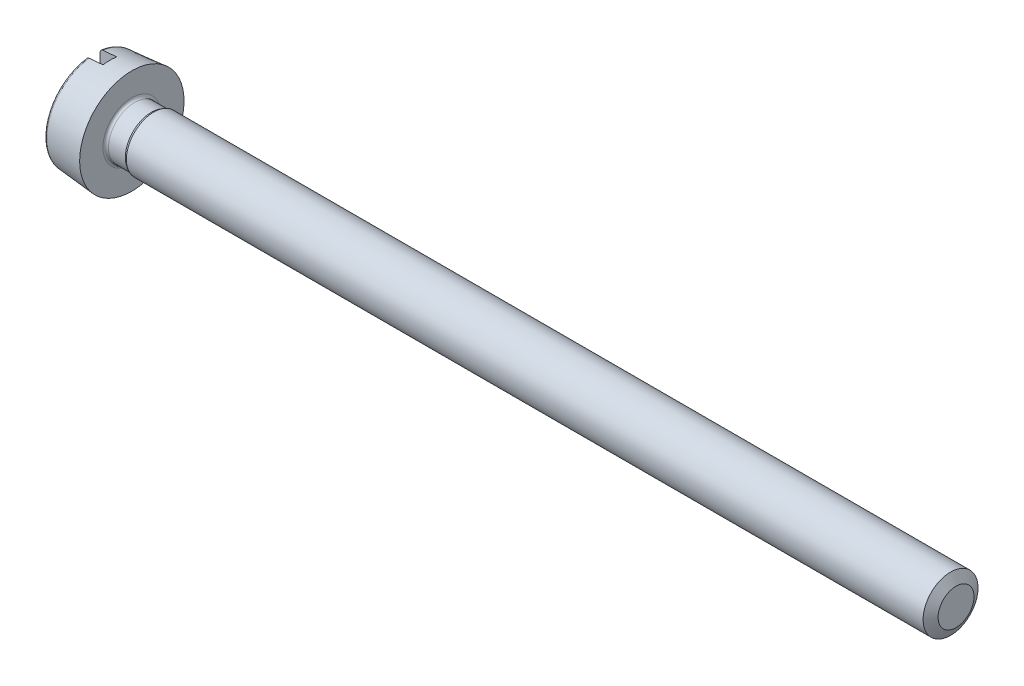
ISO-10303-21;
HEADER;
FILE_DESCRIPTION(('STEP AP214'),'2;1');
FILE_NAME('part.step','',(''),(''),'','','');
FILE_SCHEMA(('AUTOMOTIVE_DESIGN { 1 0 10303 214 1 1 1 1 }'));
ENDSEC;
DATA;
#1=APPLICATION_CONTEXT('core data for automotive mechanical design processes');
#2=APPLICATION_PROTOCOL_DEFINITION('international standard','automotive_design',2000,#1);
#3=PRODUCT_CONTEXT('',#1,'mechanical');
#4=PRODUCT('Part','Part','',(#3));
#5=PRODUCT_RELATED_PRODUCT_CATEGORY('part','',(#4));
#6=PRODUCT_DEFINITION_FORMATION('','',#4);
#7=PRODUCT_DEFINITION_CONTEXT('part definition',#1,'design');
#8=PRODUCT_DEFINITION('design','',#6,#7);
#9=PRODUCT_DEFINITION_SHAPE('','',#8);
#10=(LENGTH_UNIT() NAMED_UNIT(*) SI_UNIT(.MILLI.,.METRE.));
#11=(NAMED_UNIT(*) PLANE_ANGLE_UNIT() SI_UNIT($,.RADIAN.));
#12=(NAMED_UNIT(*) SI_UNIT($,.STERADIAN.) SOLID_ANGLE_UNIT());
#13=UNCERTAINTY_MEASURE_WITH_UNIT(LENGTH_MEASURE(1.E-05),#10,'distance_accuracy_value','');
#14=(GEOMETRIC_REPRESENTATION_CONTEXT(3) GLOBAL_UNCERTAINTY_ASSIGNED_CONTEXT((#13)) GLOBAL_UNIT_ASSIGNED_CONTEXT((#10,
#11,#12)) REPRESENTATION_CONTEXT('',''));
#15=CARTESIAN_POINT('',(0.,0.,0.));
#16=DIRECTION('',(0.,0.,1.));
#17=DIRECTION('',(1.,0.,0.));
#18=AXIS2_PLACEMENT_3D('',#15,#16,#17);
#19=CARTESIAN_POINT('',(0.,0.,0.));
#20=DIRECTION('',(-1.,0.,0.));
#21=DIRECTION('',(0.,0.,1.));
#22=AXIS2_PLACEMENT_3D('',#19,#20,#21);
#23=CYLINDRICAL_SURFACE('',#22,1.);
#24=CARTESIAN_POINT('',(2.2,0.,0.));
#25=DIRECTION('',(-1.,0.,0.));
#26=DIRECTION('',(0.,0.,1.));
#27=AXIS2_PLACEMENT_3D('',#24,#25,#26);
#28=CIRCLE('',#27,1.);
#29=CARTESIAN_POINT('',(2.2,0.,1.));
#30=VERTEX_POINT('',#29);
#31=EDGE_CURVE('E262',#30,#30,#28,.T.);
#32=ORIENTED_EDGE('',*,*,#31,.F.);
#33=EDGE_LOOP('',(#32));
#34=FACE_BOUND('',#33,.T.);
#35=CARTESIAN_POINT('',(31.2000058667527,0.,0.));
#36=DIRECTION('',(-1.,0.,0.));
#37=DIRECTION('',(0.,0.,1.));
#38=AXIS2_PLACEMENT_3D('',#35,#36,#37);
#39=CIRCLE('',#38,1.);
#40=CARTESIAN_POINT('',(31.2000058667527,0.,1.));
#41=VERTEX_POINT('',#40);
#42=EDGE_CURVE('E178',#41,#41,#39,.T.);
#43=ORIENTED_EDGE('',*,*,#42,.T.);
#44=EDGE_LOOP('',(#43));
#45=FACE_BOUND('',#44,.T.);
#46=ADVANCED_FACE('F39',(#34,#45),#23,.T.);
#47=CARTESIAN_POINT('',(0.,0.,0.));
#48=DIRECTION('',(1.,0.,0.));
#49=DIRECTION('',(0.,0.,-1.));
#50=AXIS2_PLACEMENT_3D('',#47,#48,#49);
#51=PLANE('',#50);
#52=CARTESIAN_POINT('',(0.,0.,0.));
#53=DIRECTION('',(-1.,0.,0.));
#54=DIRECTION('',(0.,0.,1.));
#55=AXIS2_PLACEMENT_3D('',#52,#53,#54);
#56=CIRCLE('',#55,1.68588275366197);
#57=CARTESIAN_POINT('',(0.,-1.66724343126457,0.25));
#58=VERTEX_POINT('',#57);
#59=CARTESIAN_POINT('',(0.,1.66724343126457,0.25));
#60=VERTEX_POINT('',#59);
#61=EDGE_CURVE('E242',#58,#60,#56,.T.);
#62=ORIENTED_EDGE('',*,*,#61,.T.);
#63=DIRECTION('',(0.,1.,0.));
#64=VECTOR('',#63,1.);
#65=CARTESIAN_POINT('',(0.,1.88348082018374,0.25));
#66=LINE('',#65,#64);
#67=EDGE_CURVE('E175',#58,#60,#66,.T.);
#68=ORIENTED_EDGE('',*,*,#67,.F.);
#69=EDGE_LOOP('',(#62,#68));
#70=FACE_BOUND('',#69,.T.);
#71=ADVANCED_FACE('F200',(#70),#51,.F.);
#72=CARTESIAN_POINT('',(0.1,0.,0.));
#73=DIRECTION('',(-1.,0.,0.));
#74=DIRECTION('',(0.,0.,1.));
#75=AXIS2_PLACEMENT_3D('',#72,#73,#74);
#76=TOROIDAL_SURFACE('',#75,1.68588275366197,0.1);
#77=ORIENTED_EDGE('',*,*,#61,.F.);
#78=CARTESIAN_POINT('',(0.0301239837184527,-1.73954570987134,0.250000000000001));
#79=CARTESIAN_POINT('',(0.034112254025655,-1.74348114703535,0.250000000000001));
#80=CARTESIAN_POINT('',(0.0384332916495907,-1.74708479745269,0.250000000000001));
#81=CARTESIAN_POINT('',(0.0476215968885678,-1.75351988324919,0.250000000000001));
#82=CARTESIAN_POINT('',(0.0524894518418903,-1.75635047687335,0.250000000000001));
#83=CARTESIAN_POINT('',(0.062632126905778,-1.7611518726827,0.250000000000001));
#84=CARTESIAN_POINT('',(0.0679068945512787,-1.76312278549306,0.250000000000001));
#85=CARTESIAN_POINT('',(0.0787122454713204,-1.76614517825523,0.250000000000001));
#86=CARTESIAN_POINT('',(0.0842427666888276,-1.76719688002822,0.250000000000001));
#87=CARTESIAN_POINT('',(0.0953733944439468,-1.76834695503076,0.250000000000001));
#88=CARTESIAN_POINT('',(0.100972999637236,-1.76845018239128,0.250000000000001));
#89=CARTESIAN_POINT('',(0.112109811915657,-1.76771285537892,0.250000000000001));
#90=CARTESIAN_POINT('',(0.117647018058241,-1.7668722867691,0.250000000000001));
#91=CARTESIAN_POINT('',(0.128489803717952,-1.76427538353904,0.250000000000001));
#92=CARTESIAN_POINT('',(0.133795848010852,-1.76252098799906,0.250000000000001));
#93=CARTESIAN_POINT('',(0.144039730319539,-1.75814968615089,0.250000000000001));
#94=CARTESIAN_POINT('',(0.148977564711526,-1.75553277135543,0.250000000000001));
#95=CARTESIAN_POINT('',(0.15836674169469,-1.74950124280131,0.250000000000001));
#96=CARTESIAN_POINT('',(0.162816088565464,-1.74608352334629,0.250000000000001));
#97=CARTESIAN_POINT('',(0.171083921068067,-1.73855542384799,0.250000000000001));
#98=CARTESIAN_POINT('',(0.174902382724925,-1.73444501749311,0.250000000000001));
#99=CARTESIAN_POINT('',(0.181835504151915,-1.72561114445745,0.250000000000001));
#100=CARTESIAN_POINT('',(0.184943867145123,-1.72088273649891,0.250000000000001));
#101=CARTESIAN_POINT('',(0.190331805109598,-1.71097526726484,0.250000000000001));
#102=CARTESIAN_POINT('',(0.19261133485436,-1.7057961814165,0.250000000000001));
#103=CARTESIAN_POINT('',(0.196300503462131,-1.69507883946752,0.250000000000001));
#104=CARTESIAN_POINT('',(0.197701208750648,-1.68953750769915,0.250000000000001));
#105=CARTESIAN_POINT('',(0.199560107931746,-1.67829891478366,0.250000000000001));
#106=CARTESIAN_POINT('',(0.2000182569785,-1.6726016462303,0.250000000000001));
#107=CARTESIAN_POINT('',(0.199980488082452,-1.66116755240174,0.250000000000001));
#108=CARTESIAN_POINT('',(0.199477416691626,-1.65543074959808,0.250000000000001));
#109=CARTESIAN_POINT('',(0.197516883099685,-1.6441224708911,0.250000000000001));
#110=CARTESIAN_POINT('',(0.19605940106392,-1.6385509984262,0.250000000000001));
#111=CARTESIAN_POINT('',(0.192226434881595,-1.62772407078968,0.250000000000001));
#112=CARTESIAN_POINT('',(0.189849634285873,-1.62246908134511,0.250000000000001));
#113=CARTESIAN_POINT('',(0.184242507962168,-1.61243590232117,0.250000000000001));
#114=CARTESIAN_POINT('',(0.181012200803495,-1.60765770237164,0.250000000000001));
#115=CARTESIAN_POINT('',(0.173808398364609,-1.59874552852763,0.250000000000001));
#116=CARTESIAN_POINT('',(0.169839413654341,-1.59460791001411,0.250000000000001));
#117=CARTESIAN_POINT('',(0.161256212040593,-1.58706689346002,0.250000000000001));
#118=CARTESIAN_POINT('',(0.156642033668647,-1.58366345160462,0.250000000000001));
#119=CARTESIAN_POINT('',(0.146954193747203,-1.57772830420901,0.250000000000001));
#120=CARTESIAN_POINT('',(0.141886222152689,-1.57518731173971,0.250000000000001));
#121=CARTESIAN_POINT('',(0.131392256265677,-1.57100326499133,0.250000000000001));
#122=CARTESIAN_POINT('',(0.125966286684049,-1.56936014880871,0.250000000000001));
#123=CARTESIAN_POINT('',(0.114975418023079,-1.56703614777695,0.250000000000001));
#124=CARTESIAN_POINT('',(0.109412743361664,-1.56634473553345,0.250000000000001));
#125=CARTESIAN_POINT('',(0.0982506296477884,-1.56591134324025,0.250000000000001));
#126=CARTESIAN_POINT('',(0.0926511921124149,-1.56616932425487,0.250000000000001));
#127=CARTESIAN_POINT('',(0.0816068018037831,-1.56762261837648,0.250000000000001));
#128=CARTESIAN_POINT('',(0.0761611699810636,-1.56881278083002,0.250000000000001));
#129=CARTESIAN_POINT('',(0.0655461187744446,-1.57208782392462,0.250000000000001));
#130=CARTESIAN_POINT('',(0.0603767005480557,-1.57417270831481,0.250000000000001));
#131=CARTESIAN_POINT('',(0.0504429211594084,-1.57918218125947,0.250000000000001));
#132=CARTESIAN_POINT('',(0.0456798188477844,-1.58210926476464,0.250000000000001));
#133=CARTESIAN_POINT('',(0.0367063855830663,-1.58871421123321,0.250000000000001));
#134=CARTESIAN_POINT('',(0.0324960808997952,-1.59239210985535,0.250000000000001));
#135=CARTESIAN_POINT('',(0.0247028499071559,-1.60043217731811,0.250000000000001));
#136=CARTESIAN_POINT('',(0.0211264966781282,-1.60480071638002,0.250000000000001));
#137=CARTESIAN_POINT('',(0.0147478039662306,-1.61407035663433,0.250000000000001));
#138=CARTESIAN_POINT('',(0.0119455146325414,-1.61897149230336,0.250000000000001));
#139=CARTESIAN_POINT('',(0.00716047536747501,-1.62922901712882,0.250000000000001));
#140=CARTESIAN_POINT('',(0.0051877301006119,-1.63459007431171,0.250000000000001));
#141=CARTESIAN_POINT('',(0.00216211004761504,-1.64556559292559,0.250000000000001));
#142=CARTESIAN_POINT('',(0.00110924708522795,-1.6511800576128,0.250000000000001));
#143=CARTESIAN_POINT('',(-5.33425649794296E-05,-1.66255157007252,0.250000000000001));
#144=CARTESIAN_POINT('',(-0.000155417619311269,-1.66830940132641,0.250000000000001));
#145=CARTESIAN_POINT('',(0.000607195995681096,-1.67976235656454,0.250000000000001));
#146=CARTESIAN_POINT('',(0.00147213868127221,-1.68545746367548,0.250000000000001));
#147=CARTESIAN_POINT('',(0.00414869895477041,-1.69663068032758,0.250000000000001));
#148=CARTESIAN_POINT('',(0.00596193608673375,-1.70210840133309,0.250000000000001));
#149=CARTESIAN_POINT('',(0.0104866705202581,-1.71267417663622,0.250000000000001));
#150=CARTESIAN_POINT('',(0.0131970742616454,-1.71776269608294,0.250000000000001));
#151=CARTESIAN_POINT('',(0.0183021368753954,-1.72564874312837,0.250000000000001));
#152=CARTESIAN_POINT('',(0.0204534266755832,-1.72860667972899,0.250000000000001));
#153=CARTESIAN_POINT('',(0.0250639712199923,-1.7342720096424,0.250000000000001));
#154=CARTESIAN_POINT('',(0.0275232249959105,-1.73697940374289,0.250000000000001));
#155=CARTESIAN_POINT('',(0.0301239837184527,-1.73954570987134,0.250000000000001));
#156=B_SPLINE_CURVE_WITH_KNOTS('',3,(#78,#79,#80,#81,#82,#83,#84,#85,#86,#87,#88,#89,#90,#91,
#92,#93,#94,#95,#96,#97,#98,#99,#100,#101,#102,#103,#104,#105,#106,#107,#108,#109,#110,#111,
#112,#113,#114,#115,#116,#117,#118,#119,#120,#121,#122,#123,#124,#125,#126,#127,#128,#129,#130,
#131,#132,#133,#134,#135,#136,#137,#138,#139,#140,#141,#142,#143,#144,#145,#146,#147,#148,#149,
#150,#151,#152,#153,#154,#155),.UNSPECIFIED.,.T.,.F.,(4,2,2,2,2,2,2,2,2,2,2,2,2,2,2,2,2,2,2,2,2,
2,2,2,2,2,2,2,2,2,2,2,2,2,2,2,2,2,4),(0.,0.0167959110445545,0.0336100383184083,
0.0504220012837825,0.0672299061172489,0.0839517427346661,0.100673831600297,0.117360580985524,
0.13404749457459,0.150800227323111,0.16755359656452,0.184450209981753,0.201347745249247,
0.21841437976708,0.235481826278521,0.252676784421207,0.269872099922449,0.287092130544962,
0.304311786550839,0.321429553193156,0.338546297983667,0.355472401973108,0.372397338855157,
0.389133511649821,0.405868998082989,0.422512661437951,0.439156394534986,0.455849950224767,
0.47254429893197,0.489402732254282,0.506262257525773,0.523319657239104,0.540377276197228,
0.557572051898691,0.574771345386106,0.59200010906381,0.60920794938804,0.620160629655462,
0.631113275486232),.UNSPECIFIED.);
#157=CARTESIAN_POINT('',(0.0912844257252283,-1.76791351316191,0.250000000000001));
#158=VERTEX_POINT('',#157);
#159=EDGE_CURVE('E152',#58,#158,#156,.T.);
#160=ORIENTED_EDGE('',*,*,#159,.T.);
#161=CARTESIAN_POINT('',(0.0912844257252345,0.,0.));
#162=DIRECTION('',(-1.,0.,0.));
#163=DIRECTION('',(0.,0.,1.));
#164=AXIS2_PLACEMENT_3D('',#161,#162,#163);
#165=CIRCLE('',#164,1.78550222347114);
#166=CARTESIAN_POINT('',(0.0912844257252283,1.76791351316191,0.25));
#167=VERTEX_POINT('',#166);
#168=EDGE_CURVE('E115',#158,#167,#165,.T.);
#169=ORIENTED_EDGE('',*,*,#168,.T.);
#170=CARTESIAN_POINT('',(0.0384108200525434,1.58753563015567,0.25));
#171=CARTESIAN_POINT('',(0.0427902939890956,1.58407005650775,0.25));
#172=CARTESIAN_POINT('',(0.0474630469549889,1.58096901798646,0.25));
#173=CARTESIAN_POINT('',(0.0572657439915525,1.57559125576911,0.25));
#174=CARTESIAN_POINT('',(0.0623961680717357,1.57331541051489,0.25));
#175=CARTESIAN_POINT('',(0.0729671844638353,1.56966008382672,0.25));
#176=CARTESIAN_POINT('',(0.0784077499033306,1.56828052486143,0.25));
#177=CARTESIAN_POINT('',(0.0894424523036429,1.56646066317197,0.25));
#178=CARTESIAN_POINT('',(0.0950365520436796,1.56602013480385,0.25));
#179=CARTESIAN_POINT('',(0.106187916851425,1.56609100566934,0.25));
#180=CARTESIAN_POINT('',(0.111745215600339,1.56659719462549,0.25));
#181=CARTESIAN_POINT('',(0.122695887603689,1.56853573821628,0.25));
#182=CARTESIAN_POINT('',(0.128089257112214,1.56996811399837,0.25));
#183=CARTESIAN_POINT('',(0.138558934280524,1.57371510963343,0.25));
#184=CARTESIAN_POINT('',(0.143635299693183,1.57602956823662,0.25));
#185=CARTESIAN_POINT('',(0.153331512379459,1.58147155156435,0.25));
#186=CARTESIAN_POINT('',(0.15795134553212,1.58459910142769,0.25));
#187=CARTESIAN_POINT('',(0.166642844689646,1.59160307133553,0.25));
#188=CARTESIAN_POINT('',(0.170709973240091,1.59548512047215,0.25));
#189=CARTESIAN_POINT('',(0.178144005385512,1.60386991016737,0.25));
#190=CARTESIAN_POINT('',(0.181510868111661,1.60837268692731,0.25));
#191=CARTESIAN_POINT('',(0.187490500087261,1.61792751523025,0.25));
#192=CARTESIAN_POINT('',(0.190093987175765,1.62298537603827,0.25));
#193=CARTESIAN_POINT('',(0.1944245750689,1.63346332336009,0.25));
#194=CARTESIAN_POINT('',(0.196151623655146,1.63888343143487,0.25));
#195=CARTESIAN_POINT('',(0.19869656706418,1.64999030292115,0.25));
#196=CARTESIAN_POINT('',(0.19950519348372,1.65567919157283,0.25));
#197=CARTESIAN_POINT('',(0.200160111365204,1.66711218979158,0.25));
#198=CARTESIAN_POINT('',(0.200006372625093,1.67285630108606,0.25));
#199=CARTESIAN_POINT('',(0.198737358913371,1.68426056047318,0.25));
#200=CARTESIAN_POINT('',(0.197618277112314,1.68992028578479,0.25));
#201=CARTESIAN_POINT('',(0.194442698747916,1.70097049473464,0.25));
#202=CARTESIAN_POINT('',(0.192386209487117,1.70636098046994,0.25));
#203=CARTESIAN_POINT('',(0.187399427297265,1.7166994325418,0.25));
#204=CARTESIAN_POINT('',(0.184472063094779,1.72164881093218,0.25));
#205=CARTESIAN_POINT('',(0.177821112560515,1.73098021623841,0.25));
#206=CARTESIAN_POINT('',(0.174097559800523,1.73536226706347,0.25));
#207=CARTESIAN_POINT('',(0.165993769608674,1.74339353418512,0.25));
#208=CARTESIAN_POINT('',(0.161619482864612,1.74704875411544,0.25));
#209=CARTESIAN_POINT('',(0.152314080979336,1.75356401214195,0.25));
#210=CARTESIAN_POINT('',(0.147382997277304,1.75642409510351,0.25));
#211=CARTESIAN_POINT('',(0.137157313470634,1.76123793804064,0.25));
#212=CARTESIAN_POINT('',(0.131866864335231,1.76320051691167,0.25));
#213=CARTESIAN_POINT('',(0.121030177928265,1.76620211885391,0.25));
#214=CARTESIAN_POINT('',(0.115483952770111,1.76724118561498,0.25));
#215=CARTESIAN_POINT('',(0.104337264218609,1.76836005573214,0.25));
#216=CARTESIAN_POINT('',(0.0987375081693252,1.76844691644336,0.25));
#217=CARTESIAN_POINT('',(0.0876033192585384,1.76767711814466,0.25));
#218=CARTESIAN_POINT('',(0.0820688850795539,1.76682047819726,0.25));
#219=CARTESIAN_POINT('',(0.0712339359121819,1.76419215705386,0.25));
#220=CARTESIAN_POINT('',(0.0659329644744118,1.76242235604696,0.25));
#221=CARTESIAN_POINT('',(0.0557017028644438,1.75802135089928,0.25));
#222=CARTESIAN_POINT('',(0.0507714167878419,1.75539013724273,0.25));
#223=CARTESIAN_POINT('',(0.0413993898846335,1.74933132383136,0.25));
#224=CARTESIAN_POINT('',(0.0369596773547092,1.74590058763537,0.25));
#225=CARTESIAN_POINT('',(0.0287131089970525,1.73834824703872,0.25));
#226=CARTESIAN_POINT('',(0.0249062794513206,1.73422661396116,0.25));
#227=CARTESIAN_POINT('',(0.0179981143560019,1.72537218244404,0.25));
#228=CARTESIAN_POINT('',(0.01490310909226,1.72063444579746,0.25));
#229=CARTESIAN_POINT('',(0.00954325096840209,1.71071066098417,0.25));
#230=CARTESIAN_POINT('',(0.00727844426054868,1.70552458791342,0.25));
#231=CARTESIAN_POINT('',(0.00361981721141302,1.6947956662052,0.25));
#232=CARTESIAN_POINT('',(0.00223495300327874,1.68924976295692,0.25));
#233=CARTESIAN_POINT('',(0.00040837536671026,1.67800493025775,0.25));
#234=CARTESIAN_POINT('',(-3.33291319021167E-05,1.67230599935853,0.25));
#235=CARTESIAN_POINT('',(3.75123327412059E-05,1.66087218591111,0.25));
#236=CARTESIAN_POINT('',(0.000557074784948288,1.65513734594056,0.25));
#237=CARTESIAN_POINT('',(0.00255033342308912,1.64383422369474,0.25));
#238=CARTESIAN_POINT('',(0.00402428246581632,1.63826598596849,0.25));
#239=CARTESIAN_POINT('',(0.00788999970877074,1.62744650084935,0.25));
#240=CARTESIAN_POINT('',(0.0102834602468335,1.62219585873013,0.25));
#241=CARTESIAN_POINT('',(0.0159217046243912,1.61217899485775,0.25));
#242=CARTESIAN_POINT('',(0.0191654522683334,1.607412193218,0.25));
#243=CARTESIAN_POINT('',(0.0251008031700796,1.60011257766084,0.25));
#244=CARTESIAN_POINT('',(0.0275686339076146,1.59739475707805,0.25));
#245=CARTESIAN_POINT('',(0.032785764913994,1.59224410808593,0.25));
#246=CARTESIAN_POINT('',(0.0355350642370453,1.58981127871904,0.25));
#247=CARTESIAN_POINT('',(0.0384108200525434,1.58753563015567,0.25));
#248=B_SPLINE_CURVE_WITH_KNOTS('',3,(#170,#171,#172,#173,#174,#175,#176,#177,#178,#179,#180,
#181,#182,#183,#184,#185,#186,#187,#188,#189,#190,#191,#192,#193,#194,#195,#196,#197,#198,#199,
#200,#201,#202,#203,#204,#205,#206,#207,#208,#209,#210,#211,#212,#213,#214,#215,#216,#217,#218,
#219,#220,#221,#222,#223,#224,#225,#226,#227,#228,#229,#230,#231,#232,#233,#234,#235,#236,#237,
#238,#239,#240,#241,#242,#243,#244,#245,#246,#247),.UNSPECIFIED.,.T.,.F.,(4,2,2,2,2,2,2,2,2,2,2,
2,2,2,2,2,2,2,2,2,2,2,2,2,2,2,2,2,2,2,2,2,2,2,2,2,2,2,4),(0.,0.0167411910060397,
0.0335001515260867,0.0502576621545583,0.0670111455902062,0.0836726971117885,0.10033462907698,
0.116993516605719,0.133652919247718,0.150441746179846,0.167231552664634,0.184217767175993,
0.201204993610689,0.218362167205907,0.235519879250063,0.252745563649486,0.269971113860594,
0.287139377595869,0.304306917563326,0.321326154497721,0.338344430931905,0.355191689226128,
0.37203815046139,0.388759667571552,0.405480846845857,0.422167733967673,0.438854805431025,
0.455608474446361,0.472362839024728,0.489260888718256,0.50615987766299,0.523228221442542,
0.540296726824198,0.557490310608039,0.574688451553919,0.591918398070691,0.609127444285943,
0.620120485883896,0.631113490544151),.UNSPECIFIED.);
#249=EDGE_CURVE('E146',#167,#60,#248,.T.);
#250=ORIENTED_EDGE('',*,*,#249,.T.);
#251=EDGE_LOOP('',(#77,#160,#169,#250));
#252=FACE_BOUND('',#251,.T.);
#253=ADVANCED_FACE('F166',(#252),#76,.T.);
#254=CARTESIAN_POINT('',(0.,1.66724343126457,-0.25));
#255=VERTEX_POINT('',#254);
#256=CARTESIAN_POINT('',(0.,-1.66724343126457,-0.25));
#257=VERTEX_POINT('',#256);
#258=EDGE_CURVE('E105',#255,#257,#56,.T.);
#259=ORIENTED_EDGE('',*,*,#258,.T.);
#260=DIRECTION('',(0.,-1.,0.));
#261=VECTOR('',#260,1.);
#262=CARTESIAN_POINT('',(0.,1.88348082018374,-0.25));
#263=LINE('',#262,#261);
#264=EDGE_CURVE('E177',#255,#257,#263,.T.);
#265=ORIENTED_EDGE('',*,*,#264,.F.);
#266=EDGE_LOOP('',(#259,#265));
#267=FACE_BOUND('',#266,.T.);
#268=ADVANCED_FACE('F41',(#267),#51,.F.);
#269=CARTESIAN_POINT('',(0.0912844257252283,1.76791351316191,-0.25));
#270=VERTEX_POINT('',#269);
#271=CARTESIAN_POINT('',(0.0912844257252283,-1.76791351316191,-0.25));
#272=VERTEX_POINT('',#271);
#273=EDGE_CURVE('E241',#270,#272,#165,.T.);
#274=ORIENTED_EDGE('',*,*,#273,.T.);
#275=CARTESIAN_POINT('',(0.0301239837184527,-1.73954570987134,-0.25));
#276=CARTESIAN_POINT('',(0.0260780259282709,-1.7355526396478,-0.25));
#277=CARTESIAN_POINT('',(0.0223687128122035,-1.73121218004399,-0.25));
#278=CARTESIAN_POINT('',(0.0157302639131424,-1.72196511132148,-0.25));
#279=CARTESIAN_POINT('',(0.0128021718532188,-1.71705775723465,-0.25));
#280=CARTESIAN_POINT('',(0.00781155963394485,-1.70682606234138,-0.25));
#281=CARTESIAN_POINT('',(0.00574827888609277,-1.70150209285375,-0.25));
#282=CARTESIAN_POINT('',(0.00253890332468144,-1.69058637396543,-0.25));
#283=CARTESIAN_POINT('',(0.00139257748788437,-1.68499469239027,-0.25));
#284=CARTESIAN_POINT('',(4.10282908943917E-05,-1.67366122714341,-0.25));
#285=CARTESIAN_POINT('',(-0.000157937515954127,-1.66791869666336,-0.25));
#286=CARTESIAN_POINT('',(0.000406868333239572,-1.65648081813977,-0.25));
#287=CARTESIAN_POINT('',(0.00117071281055947,-1.6507854736979,-0.25));
#288=CARTESIAN_POINT('',(0.00364543682274055,-1.63958072861035,-0.25));
#289=CARTESIAN_POINT('',(0.00536002222944707,-1.63407214566351,-0.25));
#290=CARTESIAN_POINT('',(0.00969258991345429,-1.62342232819609,-0.25));
#291=CARTESIAN_POINT('',(0.0123105654239292,-1.61828109092426,-0.25));
#292=CARTESIAN_POINT('',(0.0183686871454057,-1.60853152324288,-0.25));
#293=CARTESIAN_POINT('',(0.0218060998642167,-1.60392149509217,-0.25));
#294=CARTESIAN_POINT('',(0.0294130618130887,-1.59535108561565,-0.25));
#295=CARTESIAN_POINT('',(0.0335825743199984,-1.59139067172355,-0.25));
#296=CARTESIAN_POINT('',(0.0424928099447959,-1.58427405023075,-0.25));
#297=CARTESIAN_POINT('',(0.0472275909660961,-1.58111040437778,-0.25));
#298=CARTESIAN_POINT('',(0.0571661220583321,-1.57563408783813,-0.25));
#299=CARTESIAN_POINT('',(0.0623698398595652,-1.57332135865155,-0.25));
#300=CARTESIAN_POINT('',(0.0730321903589691,-1.56964075335714,-0.25));
#301=CARTESIAN_POINT('',(0.0784870693494756,-1.5682620002125,-0.25));
#302=CARTESIAN_POINT('',(0.0895514615468668,-1.56644822093412,-0.25));
#303=CARTESIAN_POINT('',(0.0951609661760001,-1.56601314255694,-0.25));
#304=CARTESIAN_POINT('',(0.106327002489758,-1.56609980469678,-0.25));
#305=CARTESIAN_POINT('',(0.111883595726444,-1.56661383635249,-0.25));
#306=CARTESIAN_POINT('',(0.122831388816505,-1.56856777941325,-0.25));
#307=CARTESIAN_POINT('',(0.128222590680128,-1.57000767956017,-0.25));
#308=CARTESIAN_POINT('',(0.138686958017419,-1.57376928649222,-0.25));
#309=CARTESIAN_POINT('',(0.143760167134578,-1.57609087195876,-0.25));
#310=CARTESIAN_POINT('',(0.153448951544549,-1.58154646534635,-0.25));
#311=CARTESIAN_POINT('',(0.158064511721778,-1.58468050008925,-0.25));
#312=CARTESIAN_POINT('',(0.166746542197497,-1.5916967560762,-0.25));
#313=CARTESIAN_POINT('',(0.170808452559137,-1.59558461824979,-0.25));
#314=CARTESIAN_POINT('',(0.178231167530174,-1.60398009132927,-0.25));
#315=CARTESIAN_POINT('',(0.181591930079707,-1.60848773938745,-0.25));
#316=CARTESIAN_POINT('',(0.187558577382552,-1.61805131058344,-0.25));
#317=CARTESIAN_POINT('',(0.190155167963793,-1.62311303257518,-0.25));
#318=CARTESIAN_POINT('',(0.194471398021903,-1.63359750325318,-0.25));
#319=CARTESIAN_POINT('',(0.196190986225804,-1.63902027302675,-0.25));
#320=CARTESIAN_POINT('',(0.198720541525037,-1.6501311220685,-0.25));
#321=CARTESIAN_POINT('',(0.199521253042963,-1.65582131006132,-0.25));
#322=CARTESIAN_POINT('',(0.200160205109374,-1.66725556951255,-0.25));
#323=CARTESIAN_POINT('',(0.199998414852101,-1.67299964268973,-0.25));
#324=CARTESIAN_POINT('',(0.198713360352002,-1.68440229675823,-0.25));
#325=CARTESIAN_POINT('',(0.197586318442357,-1.6900604527342,-0.25));
#326=CARTESIAN_POINT('',(0.194395171653612,-1.70110618713495,-0.25));
#327=CARTESIAN_POINT('',(0.192331075364088,-1.70649376803946,-0.25));
#328=CARTESIAN_POINT('',(0.187329743049282,-1.71682501034087,-0.25));
#329=CARTESIAN_POINT('',(0.184395458897692,-1.7217701001031,-0.25));
#330=CARTESIAN_POINT('',(0.177731477244738,-1.73109181693493,-0.25));
#331=CARTESIAN_POINT('',(0.174001811840985,-1.73546846693245,-0.25));
#332=CARTESIAN_POINT('',(0.16588691119851,-1.74348794106845,-0.25));
#333=CARTESIAN_POINT('',(0.161507629441039,-1.74713678874592,-0.25));
#334=CARTESIAN_POINT('',(0.152193383444686,-1.75363855606621,-0.25));
#335=CARTESIAN_POINT('',(0.147258449475751,-1.75649151903658,-0.25));
#336=CARTESIAN_POINT('',(0.137026259848382,-1.76129070832176,-0.25));
#337=CARTESIAN_POINT('',(0.131733133431451,-1.76324573979349,-0.25));
#338=CARTESIAN_POINT('',(0.120892616958677,-1.76623183391573,-0.25));
#339=CARTESIAN_POINT('',(0.115345249136051,-1.76726297719812,-0.25));
#340=CARTESIAN_POINT('',(0.104198164295004,-1.76836600998606,-0.25));
#341=CARTESIAN_POINT('',(0.0985991525060395,-1.76844503986814,-0.25));
#342=CARTESIAN_POINT('',(0.0874662076269176,-1.76765975687259,-0.25));
#343=CARTESIAN_POINT('',(0.0819322899786183,-1.76679522454642,-0.25));
#344=CARTESIAN_POINT('',(0.0710974014185309,-1.76415096656149,-0.25));
#345=CARTESIAN_POINT('',(0.0657960842145959,-1.76237265523513,-0.25));
#346=CARTESIAN_POINT('',(0.0555703957728279,-1.75795545669432,-0.25));
#347=CARTESIAN_POINT('',(0.0506455770568968,-1.75531761132611,-0.25));
#348=CARTESIAN_POINT('',(0.0431273776562806,-1.75044285417604,-0.25));
#349=CARTESIAN_POINT('',(0.0403727951884049,-1.74844968976038,-0.25));
#350=CARTESIAN_POINT('',(0.0350800601103006,-1.74419427547474,-0.25));
#351=CARTESIAN_POINT('',(0.0325419067549643,-1.74193202653123,-0.25));
#352=CARTESIAN_POINT('',(0.0301239837184527,-1.73954570987134,-0.25));
#353=B_SPLINE_CURVE_WITH_KNOTS('',3,(#275,#276,#277,#278,#279,#280,#281,#282,#283,#284,#285,
#286,#287,#288,#289,#290,#291,#292,#293,#294,#295,#296,#297,#298,#299,#300,#301,#302,#303,#304,
#305,#306,#307,#308,#309,#310,#311,#312,#313,#314,#315,#316,#317,#318,#319,#320,#321,#322,#323,
#324,#325,#326,#327,#328,#329,#330,#331,#332,#333,#334,#335,#336,#337,#338,#339,#340,#341,#342,
#343,#344,#345,#346,#347,#348,#349,#350,#351,#352),.UNSPECIFIED.,.T.,.F.,(4,2,2,2,2,2,2,2,2,2,2,
2,2,2,2,2,2,2,2,2,2,2,2,2,2,2,2,2,2,2,2,2,2,2,2,2,2,2,4),(0.,0.0170411722438942,
0.0341049990186797,0.0511537867645734,0.0681982777803319,0.0853551972527309,0.102513414450954,
0.119738987255988,0.136964431036009,0.154133198727651,0.17130110545575,0.188302245400992,
0.205302216311466,0.222100636581184,0.238898126838039,0.25555978426519,0.272221239097884,
0.288880402169165,0.305540115289019,0.322329672912014,0.339120237403425,0.356107292735505,
0.373095341083042,0.390253043299335,0.407411294666675,0.42463700606849,0.441862559572752,
0.459030335786743,0.476197419326212,0.493215918450514,0.510233490915956,0.527080425228571,
0.543925889090265,0.560644941023429,0.577367882210948,0.594065017517699,0.610741988948958,
0.620926075619136,0.631110127226809),.UNSPECIFIED.);
#354=EDGE_CURVE('E153',#272,#257,#353,.T.);
#355=ORIENTED_EDGE('',*,*,#354,.T.);
#356=ORIENTED_EDGE('',*,*,#258,.F.);
#357=CARTESIAN_POINT('',(0.0384108200525432,1.58753563015567,-0.25));
#358=CARTESIAN_POINT('',(0.0339573950704064,1.59106036589541,-0.25));
#359=CARTESIAN_POINT('',(0.0298007999429174,1.59496730933873,-0.25));
#360=CARTESIAN_POINT('',(0.0222010182064337,1.60342863634492,-0.25));
#361=CARTESIAN_POINT('',(0.0187588035663532,1.60798388796709,-0.25));
#362=CARTESIAN_POINT('',(0.0126884755380017,1.61760223594506,-0.25));
#363=CARTESIAN_POINT('',(0.0100595998475483,1.62266485084517,-0.25));
#364=CARTESIAN_POINT('',(0.00568272388268363,1.63315559353335,-0.25));
#365=CARTESIAN_POINT('',(0.00393449893167435,1.63858362769256,-0.25));
#366=CARTESIAN_POINT('',(0.0013542089661854,1.64969597872031,-0.25));
#367=CARTESIAN_POINT('',(0.000529062493142419,1.65538190290297,-0.25));
#368=CARTESIAN_POINT('',(-0.000159268616023226,1.66681204026049,-0.25));
#369=CARTESIAN_POINT('',(-2.2380612921388E-05,1.67255625780414,-0.25));
#370=CARTESIAN_POINT('',(0.00121306917338662,1.6839638753701,-0.25));
#371=CARTESIAN_POINT('',(0.00231549071302734,1.68962685820058,-0.25));
#372=CARTESIAN_POINT('',(0.00545847496257951,1.70068635267493,-0.25));
#373=CARTESIAN_POINT('',(0.00749902870568319,1.70608286686519,-0.25));
#374=CARTESIAN_POINT('',(0.0124553209196922,1.71643631844883,-0.25));
#375=CARTESIAN_POINT('',(0.0153681805259013,1.72139463336573,-0.25));
#376=CARTESIAN_POINT('',(0.0219918139097583,1.73074625136146,-0.25));
#377=CARTESIAN_POINT('',(0.0257025525730671,1.73513957929154,-0.25));
#378=CARTESIAN_POINT('',(0.0337830293566338,1.7431954661646,-0.25));
#379=CARTESIAN_POINT('',(0.0381468204499065,1.74686398949027,-0.25));
#380=CARTESIAN_POINT('',(0.0474336489372381,1.75340744227511,-0.25));
#381=CARTESIAN_POINT('',(0.0523566554179291,1.75628241557153,-0.25));
#382=CARTESIAN_POINT('',(0.0625688825799925,1.76112700539214,-0.25));
#383=CARTESIAN_POINT('',(0.067853922921408,1.76310543520284,-0.25));
#384=CARTESIAN_POINT('',(0.0786825580230987,1.76613938813517,-0.25));
#385=CARTESIAN_POINT('',(0.0842261404099087,1.76719495537608,-0.25));
#386=CARTESIAN_POINT('',(0.0953701815790073,1.76834682813953,-0.25));
#387=CARTESIAN_POINT('',(0.100969908426043,1.7684502251156,-0.25));
#388=CARTESIAN_POINT('',(0.112106813064689,1.76771321576233,-0.25));
#389=CARTESIAN_POINT('',(0.117643992150451,1.76687282899674,-0.25));
#390=CARTESIAN_POINT('',(0.128486801349997,1.7642762846356,-0.25));
#391=CARTESIAN_POINT('',(0.133792894145406,1.76252205760684,-0.25));
#392=CARTESIAN_POINT('',(0.144036912707968,1.75815107926835,-0.25));
#393=CARTESIAN_POINT('',(0.148974834149096,1.75553431782578,-0.25));
#394=CARTESIAN_POINT('',(0.158364197670939,1.74950308538223,-0.25));
#395=CARTESIAN_POINT('',(0.162813645288571,1.74608551042966,-0.25));
#396=CARTESIAN_POINT('',(0.171081709116822,1.73855767538296,-0.25));
#397=CARTESIAN_POINT('',(0.174900300331172,1.73444738785467,-0.25));
#398=CARTESIAN_POINT('',(0.18183369697909,1.72561373225442,-0.25));
#399=CARTESIAN_POINT('',(0.184942206210861,1.72088542303857,-0.25));
#400=CARTESIAN_POINT('',(0.190330447701008,1.71097813078541,-0.25));
#401=CARTESIAN_POINT('',(0.192610135624697,1.70579912365806,-0.25));
#402=CARTESIAN_POINT('',(0.196299634114889,1.69508191169097,-0.25));
#403=CARTESIAN_POINT('',(0.197700511048478,1.68954063085116,-0.25));
#404=CARTESIAN_POINT('',(0.199559761114849,1.67830210616434,-0.25));
#405=CARTESIAN_POINT('',(0.200018088664459,1.67260485478783,-0.25));
#406=CARTESIAN_POINT('',(0.19998067881951,1.66117076172759,-0.25));
#407=CARTESIAN_POINT('',(0.199477787367227,1.65543394229265,-0.25));
#408=CARTESIAN_POINT('',(0.197517609613423,1.64412560727952,-0.25));
#409=CARTESIAN_POINT('',(0.19606030463383,1.63855409493865,-0.25));
#410=CARTESIAN_POINT('',(0.192227684515839,1.62772705594973,-0.25));
#411=CARTESIAN_POINT('',(0.189851052632654,1.62247199508647,-0.25));
#412=CARTESIAN_POINT('',(0.184244245083918,1.61243863509991,-0.25));
#413=CARTESIAN_POINT('',(0.181014086328864,1.60766032653354,-0.25));
#414=CARTESIAN_POINT('',(0.173810564074662,1.59874791823184,-0.25));
#415=CARTESIAN_POINT('',(0.169841712242575,1.59461017322819,-0.25));
#416=CARTESIAN_POINT('',(0.161258744744243,1.58706887510164,-0.25));
#417=CARTESIAN_POINT('',(0.156644666353809,1.58366527959455,-0.25));
#418=CARTESIAN_POINT('',(0.146956906135105,1.57772975331654,-0.25));
#419=CARTESIAN_POINT('',(0.141888904809588,1.57518855169055,-0.25));
#420=CARTESIAN_POINT('',(0.131395039843867,1.57100420461337,-0.25));
#421=CARTESIAN_POINT('',(0.125969215308607,1.5693609612099,-0.25));
#422=CARTESIAN_POINT('',(0.114979237434394,1.56703676449653,-0.25));
#423=CARTESIAN_POINT('',(0.109417329315999,1.56634518516968,-0.25));
#424=CARTESIAN_POINT('',(0.0982551532904781,1.56591124754995,-0.25));
#425=CARTESIAN_POINT('',(0.0926548774749362,1.56616909121188,-0.25));
#426=CARTESIAN_POINT('',(0.0816066443551738,1.56762238853903,-0.25));
#427=CARTESIAN_POINT('',(0.0761580649375375,1.5688131425548,-0.25));
#428=CARTESIAN_POINT('',(0.0655421563582812,1.57208964252859,-0.25));
#429=CARTESIAN_POINT('',(0.0603744926639954,1.57417429644249,-0.25));
#430=CARTESIAN_POINT('',(0.0524104046253599,1.57818971720466,-0.25));
#431=CARTESIAN_POINT('',(0.0494794583378914,1.57985966161507,-0.25));
#432=CARTESIAN_POINT('',(0.0438011029424255,1.58348674657601,-0.25));
#433=CARTESIAN_POINT('',(0.0410536927850419,1.58544388548427,-0.25));
#434=CARTESIAN_POINT('',(0.0384108200525432,1.58753563015567,-0.25));
#435=B_SPLINE_CURVE_WITH_KNOTS('',3,(#357,#358,#359,#360,#361,#362,#363,#364,#365,#366,#367,
#368,#369,#370,#371,#372,#373,#374,#375,#376,#377,#378,#379,#380,#381,#382,#383,#384,#385,#386,
#387,#388,#389,#390,#391,#392,#393,#394,#395,#396,#397,#398,#399,#400,#401,#402,#403,#404,#405,
#406,#407,#408,#409,#410,#411,#412,#413,#414,#415,#416,#417,#418,#419,#420,#421,#422,#423,#424,
#425,#426,#427,#428,#429,#430,#431,#432,#433,#434),.UNSPECIFIED.,.T.,.F.,(4,2,2,2,2,2,2,2,2,2,2,
2,2,2,2,2,2,2,2,2,2,2,2,2,2,2,2,2,2,2,2,2,2,2,2,2,2,2,4),(0.,0.0170260326836831,
0.0340750808686444,0.0511081010790942,0.0681367735254192,0.0852922394400295,0.102449000706479,
0.119674661423913,0.136900157499331,0.154069419429614,0.171237925902129,0.188258660059426,
0.2052784537698,0.222127101552699,0.238974943808382,0.255697206422081,0.272419122405355,
0.289105854300128,0.305792782233614,0.322545490967143,0.339298863330089,0.356195470160691,
0.373092980678954,0.390159593483886,0.407227031637652,0.42442199228397,0.441617289449299,
0.458837307047764,0.476056983500325,0.493174748345185,0.510291524676524,0.527217987985617,
0.544142604530748,0.560876668671792,0.577614292575123,0.594268136617213,0.610901692986446,
0.621005802745753,0.631109854728851),.UNSPECIFIED.);
#436=EDGE_CURVE('E109',#255,#270,#435,.T.);
#437=ORIENTED_EDGE('',*,*,#436,.T.);
#438=EDGE_LOOP('',(#274,#355,#356,#437));
#439=FACE_BOUND('',#438,.T.);
#440=ADVANCED_FACE('F162',(#439),#76,.T.);
#441=CARTESIAN_POINT('',(1.4,0.,0.));
#442=DIRECTION('',(1.,0.,0.));
#443=DIRECTION('',(0.,0.,-1.));
#444=AXIS2_PLACEMENT_3D('',#441,#442,#443);
#445=CONICAL_SURFACE('',#444,1.9,0.0872664625997134);
#446=CARTESIAN_POINT('',(0.6,0.,0.));
#447=DIRECTION('',(-1.,0.,0.));
#448=DIRECTION('',(0.,-1.,0.));
#449=AXIS2_PLACEMENT_3D('',#446,#447,#448);
#450=CIRCLE('',#449,1.83000906917926);
#451=CARTESIAN_POINT('',(0.6,1.8128522259904,0.25));
#452=VERTEX_POINT('',#451);
#453=CARTESIAN_POINT('',(0.6,1.8128522259904,-0.25));
#454=VERTEX_POINT('',#453);
#455=EDGE_CURVE('E107',#452,#454,#450,.T.);
#456=ORIENTED_EDGE('',*,*,#455,.F.);
#457=CARTESIAN_POINT('',(3.61980204343619,2.07923185623851,0.25));
#458=CARTESIAN_POINT('',(3.06855450271231,2.03065597408581,0.25));
#459=CARTESIAN_POINT('',(2.517308975615,1.98205722605817,0.25));
#460=CARTESIAN_POINT('',(1.41482324502742,1.88479951260137,0.25));
#461=CARTESIAN_POINT('',(0.863583041537052,1.83614054717343,0.25));
#462=CARTESIAN_POINT('',(-0.238890772560729,1.73874791087835,0.25));
#463=CARTESIAN_POINT('',(-0.790124383168084,1.69001424001054,0.25));
#464=CARTESIAN_POINT('',(-1.89258288322705,1.5924482335677,0.25));
#465=CARTESIAN_POINT('',(-2.44380777267848,1.54361589799067,0.25));
#466=CARTESIAN_POINT('',(-2.99502722871982,1.4947222511939,0.25));
#467=B_SPLINE_CURVE_WITH_KNOTS('',3,(#457,#458,#459,#460,#461,#462,#463,#464,#465,#466),
.UNSPECIFIED.,.F.,.F.,(4,2,2,2,4),(0.,1.66015096052193,3.32030188770089,4.98045282974277,
6.64060380540512),.UNSPECIFIED.);
#468=EDGE_CURVE('E11',#452,#167,#467,.T.);
#469=ORIENTED_EDGE('',*,*,#468,.T.);
#470=ORIENTED_EDGE('',*,*,#168,.F.);
#471=CARTESIAN_POINT('',(-2.99502722871982,-1.4947222511939,0.25));
#472=CARTESIAN_POINT('',(-2.06933417181378,-1.57682756017668,0.25));
#473=CARTESIAN_POINT('',(-1.14362649887209,-1.6587677723096,0.25));
#474=CARTESIAN_POINT('',(-0.0411572175963037,-1.7562118434607,0.250000000000001));
#475=CARTESIAN_POINT('',(0.135594282821313,-1.7718300376838,0.250000000000001));
#476=CARTESIAN_POINT('',(1.41482000060208,-1.88483635099131,0.250000000000001));
#477=CARTESIAN_POINT('',(2.51730762570191,-1.98207274797553,0.250000000000001));
#478=CARTESIAN_POINT('',(3.61980204343619,-2.07923185623851,0.250000000000001));
#479=B_SPLINE_CURVE_WITH_KNOTS('',3,(#471,#472,#473,#474,#475,#476,#477,#478),.UNSPECIFIED.,.F.,
.F.,(4,2,2,4),(0.,2.78798134208376,3.32030191077332,6.64060379352131),.UNSPECIFIED.);
#480=CARTESIAN_POINT('',(0.6,-1.8128522259904,0.25));
#481=VERTEX_POINT('',#480);
#482=EDGE_CURVE('E68',#158,#481,#479,.T.);
#483=ORIENTED_EDGE('',*,*,#482,.T.);
#484=CARTESIAN_POINT('',(0.6,-1.8128522259904,-0.25));
#485=VERTEX_POINT('',#484);
#486=EDGE_CURVE('E98',#485,#481,#450,.T.);
#487=ORIENTED_EDGE('',*,*,#486,.F.);
#488=CARTESIAN_POINT('',(3.61980204343619,-2.07923185623851,-0.25));
#489=CARTESIAN_POINT('',(3.06855450271231,-2.0306559740858,-0.25));
#490=CARTESIAN_POINT('',(2.517308975615,-1.98205722605817,-0.25));
#491=CARTESIAN_POINT('',(1.41482324502742,-1.88479951260137,-0.25));
#492=CARTESIAN_POINT('',(0.863583041537052,-1.83614054717343,-0.25));
#493=CARTESIAN_POINT('',(-0.238890772560729,-1.73874791087835,-0.25));
#494=CARTESIAN_POINT('',(-0.790124383168083,-1.69001424001054,-0.25));
#495=CARTESIAN_POINT('',(-1.89258288322705,-1.5924482335677,-0.25));
#496=CARTESIAN_POINT('',(-2.44380777267848,-1.54361589799067,-0.25));
#497=CARTESIAN_POINT('',(-2.99502722871982,-1.4947222511939,-0.25));
#498=B_SPLINE_CURVE_WITH_KNOTS('',3,(#488,#489,#490,#491,#492,#493,#494,#495,#496,#497),
.UNSPECIFIED.,.F.,.F.,(4,2,2,2,4),(0.,1.66015096052193,3.32030188770089,4.98045282974277,
6.64060380540512),.UNSPECIFIED.);
#499=EDGE_CURVE('E104',#485,#272,#498,.T.);
#500=ORIENTED_EDGE('',*,*,#499,.T.);
#501=ORIENTED_EDGE('',*,*,#273,.F.);
#502=CARTESIAN_POINT('',(-2.99502722871982,1.4947222511939,-0.25));
#503=CARTESIAN_POINT('',(-2.06933417181378,1.57682756017668,-0.25));
#504=CARTESIAN_POINT('',(-1.14362649887209,1.6587677723096,-0.25));
#505=CARTESIAN_POINT('',(-0.0411572175963037,1.7562118434607,-0.25));
#506=CARTESIAN_POINT('',(0.135594282821313,1.7718300376838,-0.25));
#507=CARTESIAN_POINT('',(1.41482000060208,1.88483635099131,-0.25));
#508=CARTESIAN_POINT('',(2.51730762570191,1.98207274797553,-0.25));
#509=CARTESIAN_POINT('',(3.61980204343619,2.07923185623851,-0.25));
#510=B_SPLINE_CURVE_WITH_KNOTS('',3,(#502,#503,#504,#505,#506,#507,#508,#509),.UNSPECIFIED.,.F.,
.F.,(4,2,2,4),(0.,2.78798134208376,3.32030191077332,6.64060379352131),.UNSPECIFIED.);
#511=EDGE_CURVE('E53',#270,#454,#510,.T.);
#512=ORIENTED_EDGE('',*,*,#511,.T.);
#513=EDGE_LOOP('',(#456,#469,#470,#483,#487,#500,#501,#512));
#514=FACE_BOUND('',#513,.T.);
#515=CARTESIAN_POINT('',(1.4,0.,0.));
#516=DIRECTION('',(-1.,0.,0.));
#517=DIRECTION('',(0.,0.,1.));
#518=AXIS2_PLACEMENT_3D('',#515,#516,#517);
#519=CIRCLE('',#518,1.9);
#520=CARTESIAN_POINT('',(1.4,0.,1.9));
#521=VERTEX_POINT('',#520);
#522=EDGE_CURVE('E228',#521,#521,#519,.T.);
#523=ORIENTED_EDGE('',*,*,#522,.T.);
#524=EDGE_LOOP('',(#523));
#525=FACE_BOUND('',#524,.T.);
#526=ADVANCED_FACE('F112',(#514,#525),#445,.T.);
#527=CARTESIAN_POINT('',(1.4,1.9,0.));
#528=DIRECTION('',(-1.,0.,0.));
#529=DIRECTION('',(0.,0.,1.));
#530=AXIS2_PLACEMENT_3D('',#527,#528,#529);
#531=PLANE('',#530);
#532=ORIENTED_EDGE('',*,*,#522,.F.);
#533=EDGE_LOOP('',(#532));
#534=FACE_BOUND('',#533,.T.);
#535=CARTESIAN_POINT('',(1.4,0.,0.));
#536=DIRECTION('',(-1.,0.,0.));
#537=DIRECTION('',(0.,0.,1.));
#538=AXIS2_PLACEMENT_3D('',#535,#536,#537);
#539=CIRCLE('',#538,1.05);
#540=CARTESIAN_POINT('',(1.4,0.,1.05));
#541=VERTEX_POINT('',#540);
#542=EDGE_CURVE('E231',#541,#541,#539,.T.);
#543=ORIENTED_EDGE('',*,*,#542,.T.);
#544=EDGE_LOOP('',(#543));
#545=FACE_BOUND('',#544,.T.);
#546=ADVANCED_FACE('F218',(#534,#545),#531,.F.);
#547=CARTESIAN_POINT('',(1.5,0.,0.));
#548=DIRECTION('',(-1.,0.,0.));
#549=DIRECTION('',(0.,0.,1.));
#550=AXIS2_PLACEMENT_3D('',#547,#548,#549);
#551=TOROIDAL_SURFACE('',#550,1.05,0.0999999999999998);
#552=ORIENTED_EDGE('',*,*,#542,.F.);
#553=EDGE_LOOP('',(#552));
#554=FACE_BOUND('',#553,.T.);
#555=CARTESIAN_POINT('',(1.5,0.,0.));
#556=DIRECTION('',(-1.,0.,0.));
#557=DIRECTION('',(0.,0.,1.));
#558=AXIS2_PLACEMENT_3D('',#555,#556,#557);
#559=CIRCLE('',#558,0.95);
#560=CARTESIAN_POINT('',(1.5,0.,0.95));
#561=VERTEX_POINT('',#560);
#562=EDGE_CURVE('E232',#561,#561,#559,.T.);
#563=ORIENTED_EDGE('',*,*,#562,.T.);
#564=EDGE_LOOP('',(#563));
#565=FACE_BOUND('',#564,.T.);
#566=ADVANCED_FACE('F215',(#554,#565),#551,.F.);
#567=CARTESIAN_POINT('',(0.,0.,0.));
#568=DIRECTION('',(-1.,0.,0.));
#569=DIRECTION('',(0.,0.,1.));
#570=AXIS2_PLACEMENT_3D('',#567,#568,#569);
#571=CYLINDRICAL_SURFACE('',#570,0.95);
#572=ORIENTED_EDGE('',*,*,#562,.F.);
#573=EDGE_LOOP('',(#572));
#574=FACE_BOUND('',#573,.T.);
#575=CARTESIAN_POINT('',(2.11339745962156,0.,0.));
#576=DIRECTION('',(-1.,0.,0.));
#577=DIRECTION('',(0.,0.,1.));
#578=AXIS2_PLACEMENT_3D('',#575,#576,#577);
#579=CIRCLE('',#578,0.95);
#580=CARTESIAN_POINT('',(2.11339745962156,0.,0.95));
#581=VERTEX_POINT('',#580);
#582=EDGE_CURVE('E236',#581,#581,#579,.T.);
#583=ORIENTED_EDGE('',*,*,#582,.T.);
#584=EDGE_LOOP('',(#583));
#585=FACE_BOUND('',#584,.T.);
#586=ADVANCED_FACE('F211',(#574,#585),#571,.T.);
#587=CARTESIAN_POINT('',(2.2,0.,0.));
#588=DIRECTION('',(1.,0.,0.));
#589=DIRECTION('',(0.,0.,-1.));
#590=AXIS2_PLACEMENT_3D('',#587,#588,#589);
#591=CONICAL_SURFACE('',#590,1.,0.5235987755983);
#592=ORIENTED_EDGE('',*,*,#582,.F.);
#593=EDGE_LOOP('',(#592));
#594=FACE_BOUND('',#593,.T.);
#595=ORIENTED_EDGE('',*,*,#31,.T.);
#596=EDGE_LOOP('',(#595));
#597=FACE_BOUND('',#596,.T.);
#598=ADVANCED_FACE('F137',(#594,#597),#591,.T.);
#599=CARTESIAN_POINT('',(0.6,1.88348082018374,0.25));
#600=DIRECTION('',(0.,0.,1.));
#601=DIRECTION('',(0.,-1.,0.));
#602=AXIS2_PLACEMENT_3D('',#599,#600,#601);
#603=PLANE('',#602);
#604=ORIENTED_EDGE('',*,*,#67,.T.);
#605=ORIENTED_EDGE('',*,*,#249,.F.);
#606=ORIENTED_EDGE('',*,*,#468,.F.);
#607=DIRECTION('',(0.,1.,0.));
#608=VECTOR('',#607,1.);
#609=CARTESIAN_POINT('',(0.6,1.88348082018374,0.25));
#610=LINE('',#609,#608);
#611=EDGE_CURVE('E100',#481,#452,#610,.T.);
#612=ORIENTED_EDGE('',*,*,#611,.F.);
#613=ORIENTED_EDGE('',*,*,#482,.F.);
#614=ORIENTED_EDGE('',*,*,#159,.F.);
#615=EDGE_LOOP('',(#604,#605,#606,#612,#613,#614));
#616=FACE_BOUND('',#615,.T.);
#617=ADVANCED_FACE('F108',(#616),#603,.F.);
#618=CARTESIAN_POINT('',(0.6,1.88348082018374,-0.25));
#619=DIRECTION('',(0.,0.,-1.));
#620=DIRECTION('',(-1.,0.,0.));
#621=AXIS2_PLACEMENT_3D('',#618,#619,#620);
#622=PLANE('',#621);
#623=ORIENTED_EDGE('',*,*,#499,.F.);
#624=DIRECTION('',(0.,-1.,0.));
#625=VECTOR('',#624,1.);
#626=CARTESIAN_POINT('',(0.6,1.88348082018374,-0.25));
#627=LINE('',#626,#625);
#628=EDGE_CURVE('E60',#454,#485,#627,.T.);
#629=ORIENTED_EDGE('',*,*,#628,.F.);
#630=ORIENTED_EDGE('',*,*,#511,.F.);
#631=ORIENTED_EDGE('',*,*,#436,.F.);
#632=ORIENTED_EDGE('',*,*,#264,.T.);
#633=ORIENTED_EDGE('',*,*,#354,.F.);
#634=EDGE_LOOP('',(#623,#629,#630,#631,#632,#633));
#635=FACE_BOUND('',#634,.T.);
#636=ADVANCED_FACE('F136',(#635),#622,.F.);
#637=CARTESIAN_POINT('',(0.6,0.,0.));
#638=DIRECTION('',(-1.,0.,0.));
#639=DIRECTION('',(0.,-1.,0.));
#640=AXIS2_PLACEMENT_3D('',#637,#638,#639);
#641=PLANE('',#640);
#642=ORIENTED_EDGE('',*,*,#455,.T.);
#643=ORIENTED_EDGE('',*,*,#628,.T.);
#644=ORIENTED_EDGE('',*,*,#486,.T.);
#645=ORIENTED_EDGE('',*,*,#611,.T.);
#646=EDGE_LOOP('',(#642,#643,#644,#645));
#647=FACE_BOUND('',#646,.T.);
#648=ADVANCED_FACE('F99',(#647),#641,.T.);
#649=CARTESIAN_POINT('',(31.2000058667527,0.,0.));
#650=DIRECTION('',(-1.,0.,0.));
#651=DIRECTION('',(0.,0.,1.));
#652=AXIS2_PLACEMENT_3D('',#649,#650,#651);
#653=CONICAL_SURFACE('',#652,1.,1.0471975511966);
#654=CARTESIAN_POINT('',(31.4,0.,0.));
#655=DIRECTION('',(-1.,0.,0.));
#656=DIRECTION('',(0.,0.,1.));
#657=AXIS2_PLACEMENT_3D('',#654,#655,#656);
#658=CIRCLE('',#657,0.6536);
#659=CARTESIAN_POINT('',(31.4,0.,0.6536));
#660=VERTEX_POINT('',#659);
#661=EDGE_CURVE('E183',#660,#660,#658,.T.);
#662=ORIENTED_EDGE('',*,*,#661,.T.);
#663=EDGE_LOOP('',(#662));
#664=FACE_BOUND('',#663,.T.);
#665=ORIENTED_EDGE('',*,*,#42,.F.);
#666=EDGE_LOOP('',(#665));
#667=FACE_BOUND('',#666,.T.);
#668=ADVANCED_FACE('F190',(#664,#667),#653,.T.);
#669=CARTESIAN_POINT('',(31.4,1.,0.));
#670=DIRECTION('',(-1.,0.,0.));
#671=DIRECTION('',(0.,0.,1.));
#672=AXIS2_PLACEMENT_3D('',#669,#670,#671);
#673=PLANE('',#672);
#674=ORIENTED_EDGE('',*,*,#661,.F.);
#675=EDGE_LOOP('',(#674));
#676=FACE_BOUND('',#675,.T.);
#677=ADVANCED_FACE('F193',(#676),#673,.F.);
#678=CLOSED_SHELL('',(#46,#71,#253,#268,#440,#526,#546,#566,#586,#598,#617,#636,#648,#668,#677));
#679=MANIFOLD_SOLID_BREP('B2',#678);
#680=ADVANCED_BREP_SHAPE_REPRESENTATION('',(#18,#679),#14);
#681=SHAPE_DEFINITION_REPRESENTATION(#9,#680);
ENDSEC;
END-ISO-10303-21;
